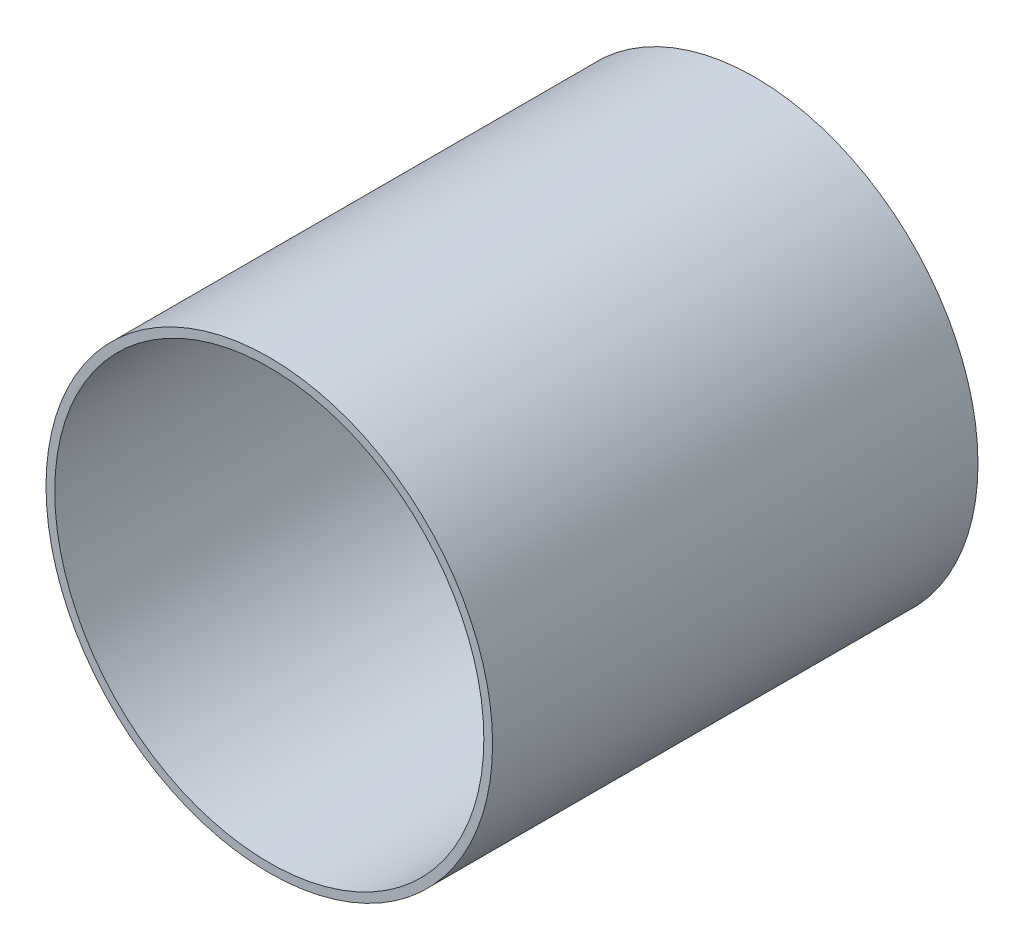
ISO-10303-21;
HEADER;
FILE_DESCRIPTION(('STEP AP214'),'2;1');
FILE_NAME('part.step','',(''),(''),'','','');
FILE_SCHEMA(('AUTOMOTIVE_DESIGN { 1 0 10303 214 1 1 1 1 }'));
ENDSEC;
DATA;
#1=APPLICATION_CONTEXT('core data for automotive mechanical design processes');
#2=APPLICATION_PROTOCOL_DEFINITION('international standard','automotive_design',2000,#1);
#3=PRODUCT_CONTEXT('',#1,'mechanical');
#4=PRODUCT('Part','Part','',(#3));
#5=PRODUCT_RELATED_PRODUCT_CATEGORY('part','',(#4));
#6=PRODUCT_DEFINITION_FORMATION('','',#4);
#7=PRODUCT_DEFINITION_CONTEXT('part definition',#1,'design');
#8=PRODUCT_DEFINITION('design','',#6,#7);
#9=PRODUCT_DEFINITION_SHAPE('','',#8);
#10=(LENGTH_UNIT() NAMED_UNIT(*) SI_UNIT(.MILLI.,.METRE.));
#11=(NAMED_UNIT(*) PLANE_ANGLE_UNIT() SI_UNIT($,.RADIAN.));
#12=(NAMED_UNIT(*) SI_UNIT($,.STERADIAN.) SOLID_ANGLE_UNIT());
#13=UNCERTAINTY_MEASURE_WITH_UNIT(LENGTH_MEASURE(1.E-05),#10,'distance_accuracy_value','');
#14=(GEOMETRIC_REPRESENTATION_CONTEXT(3) GLOBAL_UNCERTAINTY_ASSIGNED_CONTEXT((#13)) GLOBAL_UNIT_ASSIGNED_CONTEXT((#10,
#11,#12)) REPRESENTATION_CONTEXT('',''));
#15=CARTESIAN_POINT('',(0.,0.,0.));
#16=DIRECTION('',(0.,0.,1.));
#17=DIRECTION('',(1.,0.,0.));
#18=AXIS2_PLACEMENT_3D('',#15,#16,#17);
#19=CARTESIAN_POINT('',(0.,0.,25.));
#20=DIRECTION('',(0.,0.,1.));
#21=DIRECTION('',(1.,0.,0.));
#22=AXIS2_PLACEMENT_3D('',#19,#20,#21);
#23=PLANE('',#22);
#24=CARTESIAN_POINT('',(0.,0.,25.));
#25=DIRECTION('',(0.,0.,1.));
#26=DIRECTION('',(1.,0.,0.));
#27=AXIS2_PLACEMENT_3D('',#24,#25,#26);
#28=CIRCLE('',#27,11.5);
#29=CARTESIAN_POINT('',(11.5,0.,25.));
#30=VERTEX_POINT('',#29);
#31=EDGE_CURVE('E10',#30,#30,#28,.T.);
#32=ORIENTED_EDGE('',*,*,#31,.T.);
#33=EDGE_LOOP('',(#32));
#34=FACE_BOUND('',#33,.T.);
#35=CARTESIAN_POINT('',(0.,0.,25.));
#36=DIRECTION('',(0.,0.,1.));
#37=DIRECTION('',(1.,0.,0.));
#38=AXIS2_PLACEMENT_3D('',#35,#36,#37);
#39=CIRCLE('',#38,11.05);
#40=CARTESIAN_POINT('',(11.05,0.,25.));
#41=VERTEX_POINT('',#40);
#42=EDGE_CURVE('E42',#41,#41,#39,.T.);
#43=ORIENTED_EDGE('',*,*,#42,.F.);
#44=EDGE_LOOP('',(#43));
#45=FACE_BOUND('',#44,.T.);
#46=ADVANCED_FACE('F31',(#34,#45),#23,.T.);
#47=CARTESIAN_POINT('',(0.,0.,0.));
#48=DIRECTION('',(0.,0.,1.));
#49=DIRECTION('',(1.,0.,0.));
#50=AXIS2_PLACEMENT_3D('',#47,#48,#49);
#51=PLANE('',#50);
#52=CARTESIAN_POINT('',(0.,0.,0.));
#53=DIRECTION('',(0.,0.,1.));
#54=DIRECTION('',(1.,0.,0.));
#55=AXIS2_PLACEMENT_3D('',#52,#53,#54);
#56=CIRCLE('',#55,11.5);
#57=CARTESIAN_POINT('',(11.5,0.,0.));
#58=VERTEX_POINT('',#57);
#59=EDGE_CURVE('E35',#58,#58,#56,.T.);
#60=ORIENTED_EDGE('',*,*,#59,.F.);
#61=EDGE_LOOP('',(#60));
#62=FACE_BOUND('',#61,.T.);
#63=CARTESIAN_POINT('',(0.,0.,0.));
#64=DIRECTION('',(0.,0.,1.));
#65=DIRECTION('',(1.,0.,0.));
#66=AXIS2_PLACEMENT_3D('',#63,#64,#65);
#67=CIRCLE('',#66,11.05);
#68=CARTESIAN_POINT('',(11.05,0.,0.));
#69=VERTEX_POINT('',#68);
#70=EDGE_CURVE('E44',#69,#69,#67,.T.);
#71=ORIENTED_EDGE('',*,*,#70,.T.);
#72=EDGE_LOOP('',(#71));
#73=FACE_BOUND('',#72,.T.);
#74=ADVANCED_FACE('F54',(#62,#73),#51,.F.);
#75=CARTESIAN_POINT('',(0.,0.,25.));
#76=DIRECTION('',(0.,0.,-1.));
#77=DIRECTION('',(-1.,0.,0.));
#78=AXIS2_PLACEMENT_3D('',#75,#76,#77);
#79=CYLINDRICAL_SURFACE('',#78,11.5);
#80=ORIENTED_EDGE('',*,*,#31,.F.);
#81=EDGE_LOOP('',(#80));
#82=FACE_BOUND('',#81,.T.);
#83=ORIENTED_EDGE('',*,*,#59,.T.);
#84=EDGE_LOOP('',(#83));
#85=FACE_BOUND('',#84,.T.);
#86=ADVANCED_FACE('F33',(#82,#85),#79,.T.);
#87=CARTESIAN_POINT('',(0.,0.,25.));
#88=DIRECTION('',(0.,0.,-1.));
#89=DIRECTION('',(-1.,0.,0.));
#90=AXIS2_PLACEMENT_3D('',#87,#88,#89);
#91=CYLINDRICAL_SURFACE('',#90,11.05);
#92=ORIENTED_EDGE('',*,*,#42,.T.);
#93=EDGE_LOOP('',(#92));
#94=FACE_BOUND('',#93,.T.);
#95=ORIENTED_EDGE('',*,*,#70,.F.);
#96=EDGE_LOOP('',(#95));
#97=FACE_BOUND('',#96,.T.);
#98=ADVANCED_FACE('F50',(#94,#97),#91,.F.);
#99=CLOSED_SHELL('',(#46,#74,#86,#98));
#100=MANIFOLD_SOLID_BREP('B2',#99);
#101=ADVANCED_BREP_SHAPE_REPRESENTATION('',(#18,#100),#14);
#102=SHAPE_DEFINITION_REPRESENTATION(#9,#101);
ENDSEC;
END-ISO-10303-21;
